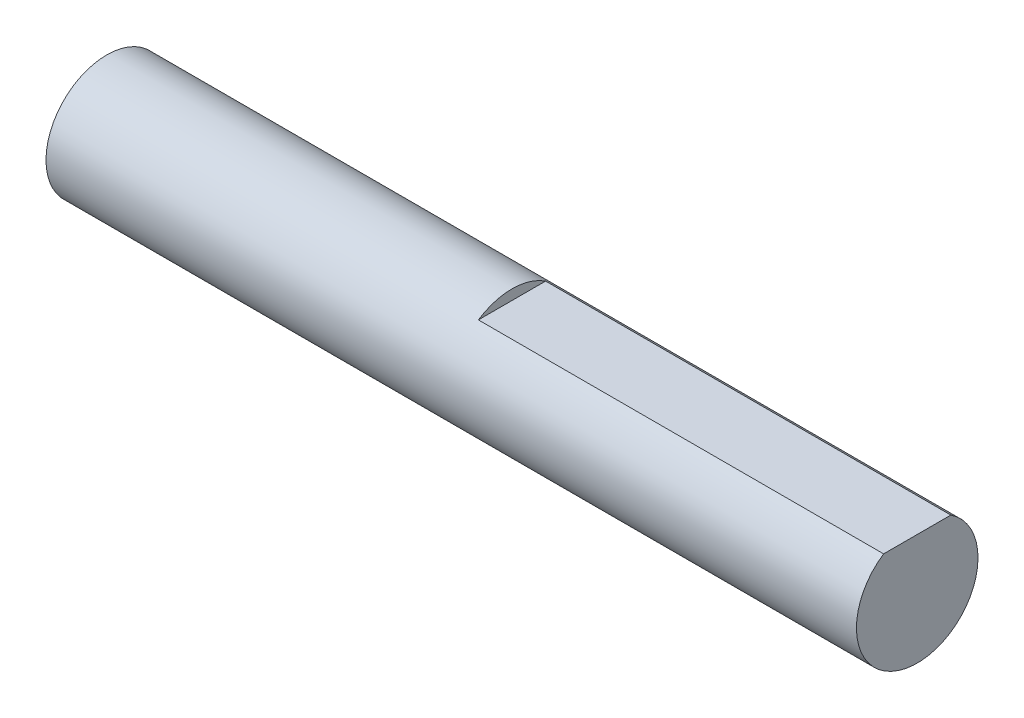
ISO-10303-21;
HEADER;
FILE_DESCRIPTION(('STEP AP214'),'2;1');
FILE_NAME('part.step','',(''),(''),'','','');
FILE_SCHEMA(('AUTOMOTIVE_DESIGN { 1 0 10303 214 1 1 1 1 }'));
ENDSEC;
DATA;
#1=APPLICATION_CONTEXT('core data for automotive mechanical design processes');
#2=APPLICATION_PROTOCOL_DEFINITION('international standard','automotive_design',2000,#1);
#3=PRODUCT_CONTEXT('',#1,'mechanical');
#4=PRODUCT('Part','Part','',(#3));
#5=PRODUCT_RELATED_PRODUCT_CATEGORY('part','',(#4));
#6=PRODUCT_DEFINITION_FORMATION('','',#4);
#7=PRODUCT_DEFINITION_CONTEXT('part definition',#1,'design');
#8=PRODUCT_DEFINITION('design','',#6,#7);
#9=PRODUCT_DEFINITION_SHAPE('','',#8);
#10=(LENGTH_UNIT() NAMED_UNIT(*) SI_UNIT(.MILLI.,.METRE.));
#11=(NAMED_UNIT(*) PLANE_ANGLE_UNIT() SI_UNIT($,.RADIAN.));
#12=(NAMED_UNIT(*) SI_UNIT($,.STERADIAN.) SOLID_ANGLE_UNIT());
#13=UNCERTAINTY_MEASURE_WITH_UNIT(LENGTH_MEASURE(1.E-05),#10,'distance_accuracy_value','');
#14=(GEOMETRIC_REPRESENTATION_CONTEXT(3) GLOBAL_UNCERTAINTY_ASSIGNED_CONTEXT((#13)) GLOBAL_UNIT_ASSIGNED_CONTEXT((#10,
#11,#12)) REPRESENTATION_CONTEXT('',''));
#15=CARTESIAN_POINT('',(0.,0.,0.));
#16=DIRECTION('',(0.,0.,1.));
#17=DIRECTION('',(1.,0.,0.));
#18=AXIS2_PLACEMENT_3D('',#15,#16,#17);
#19=CARTESIAN_POINT('',(40.,0.,0.));
#20=DIRECTION('',(-1.,0.,0.));
#21=DIRECTION('',(0.,0.,1.));
#22=AXIS2_PLACEMENT_3D('',#19,#20,#21);
#23=CYLINDRICAL_SURFACE('',#22,3.);
#24=DIRECTION('',(-1.,0.,0.));
#25=VECTOR('',#24,1.);
#26=CARTESIAN_POINT('',(40.,2.5,1.6583123951777));
#27=LINE('',#26,#25);
#28=CARTESIAN_POINT('',(40.,2.5,1.6583123951777));
#29=VERTEX_POINT('',#28);
#30=CARTESIAN_POINT('',(20.,2.5,1.6583123951777));
#31=VERTEX_POINT('',#30);
#32=EDGE_CURVE('E47',#29,#31,#27,.T.);
#33=ORIENTED_EDGE('',*,*,#32,.T.);
#34=CARTESIAN_POINT('',(20.,0.,0.));
#35=DIRECTION('',(-1.,0.,0.));
#36=DIRECTION('',(0.,0.,1.));
#37=AXIS2_PLACEMENT_3D('',#34,#35,#36);
#38=CIRCLE('',#37,3.);
#39=CARTESIAN_POINT('',(20.,2.5,-1.6583123951777));
#40=VERTEX_POINT('',#39);
#41=EDGE_CURVE('E11',#31,#40,#38,.T.);
#42=ORIENTED_EDGE('',*,*,#41,.T.);
#43=DIRECTION('',(-1.,0.,0.));
#44=VECTOR('',#43,1.);
#45=CARTESIAN_POINT('',(40.,2.5,-1.6583123951777));
#46=LINE('',#45,#44);
#47=CARTESIAN_POINT('',(40.,2.5,-1.6583123951777));
#48=VERTEX_POINT('',#47);
#49=EDGE_CURVE('E59',#40,#48,#46,.F.);
#50=ORIENTED_EDGE('',*,*,#49,.T.);
#51=CARTESIAN_POINT('',(40.,0.,0.));
#52=DIRECTION('',(1.,0.,0.));
#53=DIRECTION('',(0.,0.,-1.));
#54=AXIS2_PLACEMENT_3D('',#51,#52,#53);
#55=CIRCLE('',#54,3.);
#56=EDGE_CURVE('E63',#29,#48,#55,.T.);
#57=ORIENTED_EDGE('',*,*,#56,.F.);
#58=EDGE_LOOP('',(#33,#42,#50,#57));
#59=FACE_BOUND('',#58,.T.);
#60=CARTESIAN_POINT('',(0.,0.,0.));
#61=DIRECTION('',(1.,0.,0.));
#62=DIRECTION('',(0.,0.,-1.));
#63=AXIS2_PLACEMENT_3D('',#60,#61,#62);
#64=CIRCLE('',#63,3.);
#65=CARTESIAN_POINT('',(0.,0.,-3.));
#66=VERTEX_POINT('',#65);
#67=EDGE_CURVE('E69',#66,#66,#64,.T.);
#68=ORIENTED_EDGE('',*,*,#67,.T.);
#69=EDGE_LOOP('',(#68));
#70=FACE_BOUND('',#69,.T.);
#71=ADVANCED_FACE('F33',(#59,#70),#23,.T.);
#72=CARTESIAN_POINT('',(40.,0.,0.));
#73=DIRECTION('',(1.,0.,0.));
#74=DIRECTION('',(0.,0.,-1.));
#75=AXIS2_PLACEMENT_3D('',#72,#73,#74);
#76=PLANE('',#75);
#77=DIRECTION('',(0.,0.,-1.));
#78=VECTOR('',#77,1.);
#79=CARTESIAN_POINT('',(40.,2.5,0.));
#80=LINE('',#79,#78);
#81=EDGE_CURVE('E40',#29,#48,#80,.T.);
#82=ORIENTED_EDGE('',*,*,#81,.F.);
#83=ORIENTED_EDGE('',*,*,#56,.T.);
#84=EDGE_LOOP('',(#82,#83));
#85=FACE_BOUND('',#84,.T.);
#86=ADVANCED_FACE('F68',(#85),#76,.T.);
#87=CARTESIAN_POINT('',(0.,0.,0.));
#88=DIRECTION('',(1.,0.,0.));
#89=DIRECTION('',(0.,0.,-1.));
#90=AXIS2_PLACEMENT_3D('',#87,#88,#89);
#91=PLANE('',#90);
#92=ORIENTED_EDGE('',*,*,#67,.F.);
#93=EDGE_LOOP('',(#92));
#94=FACE_BOUND('',#93,.T.);
#95=ADVANCED_FACE('F77',(#94),#91,.F.);
#96=CARTESIAN_POINT('',(20.,2.5,-5.98713122859458));
#97=DIRECTION('',(-1.,0.,0.));
#98=DIRECTION('',(0.,0.,1.));
#99=AXIS2_PLACEMENT_3D('',#96,#97,#98);
#100=PLANE('',#99);
#101=DIRECTION('',(0.,0.,1.));
#102=VECTOR('',#101,1.);
#103=CARTESIAN_POINT('',(20.,2.5,-5.98713122859458));
#104=LINE('',#103,#102);
#105=EDGE_CURVE('E66',#40,#31,#104,.T.);
#106=ORIENTED_EDGE('',*,*,#105,.F.);
#107=ORIENTED_EDGE('',*,*,#41,.F.);
#108=EDGE_LOOP('',(#106,#107));
#109=FACE_BOUND('',#108,.T.);
#110=ADVANCED_FACE('F75',(#109),#100,.F.);
#111=CARTESIAN_POINT('',(0.,2.5,0.));
#112=DIRECTION('',(0.,-1.,0.));
#113=DIRECTION('',(0.,0.,-1.));
#114=AXIS2_PLACEMENT_3D('',#111,#112,#113);
#115=PLANE('',#114);
#116=ORIENTED_EDGE('',*,*,#81,.T.);
#117=ORIENTED_EDGE('',*,*,#49,.F.);
#118=ORIENTED_EDGE('',*,*,#105,.T.);
#119=ORIENTED_EDGE('',*,*,#32,.F.);
#120=EDGE_LOOP('',(#116,#117,#118,#119));
#121=FACE_BOUND('',#120,.T.);
#122=ADVANCED_FACE('F58',(#121),#115,.F.);
#123=CLOSED_SHELL('',(#71,#86,#95,#110,#122));
#124=MANIFOLD_SOLID_BREP('B2',#123);
#125=ADVANCED_BREP_SHAPE_REPRESENTATION('',(#18,#124),#14);
#126=SHAPE_DEFINITION_REPRESENTATION(#9,#125);
ENDSEC;
END-ISO-10303-21;
